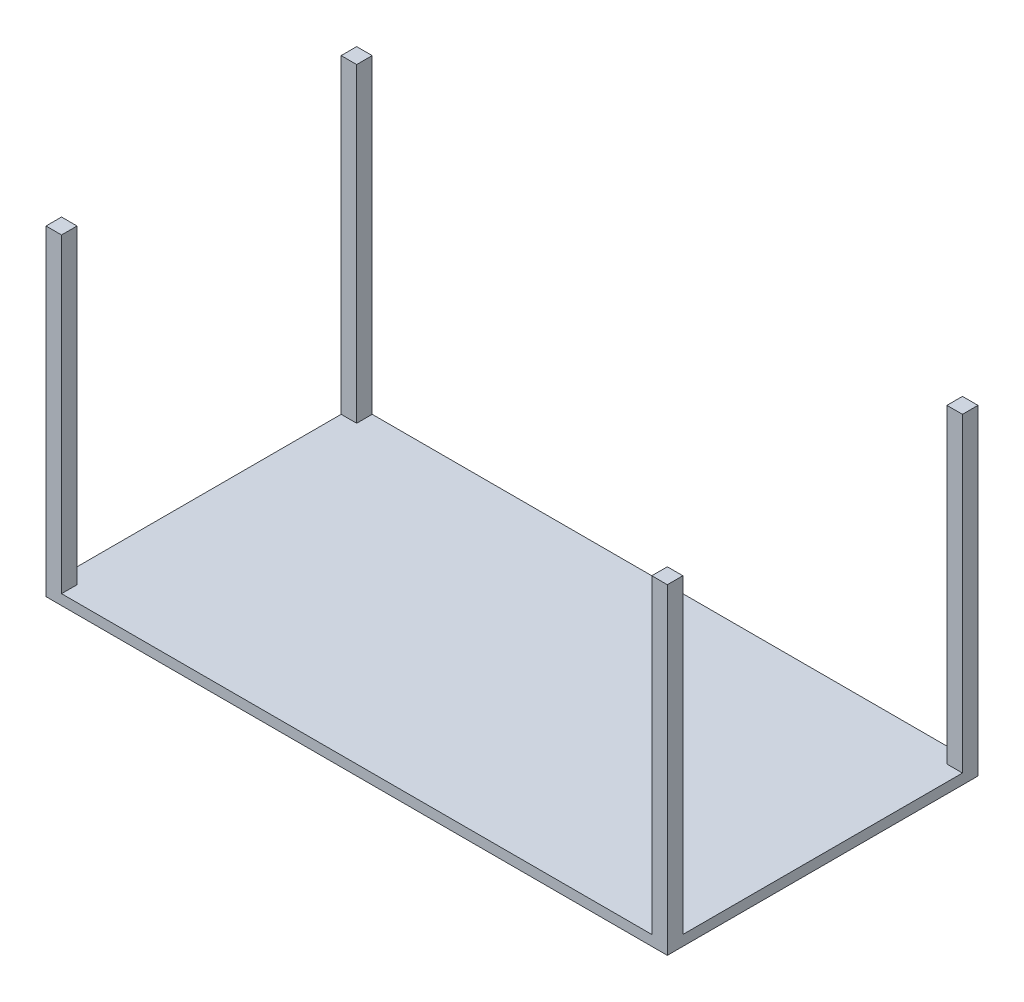
ISO-10303-21;
HEADER;
FILE_DESCRIPTION(('STEP AP214'),'2;1');
FILE_NAME('part.step','',(''),(''),'','','');
FILE_SCHEMA(('AUTOMOTIVE_DESIGN { 1 0 10303 214 1 1 1 1 }'));
ENDSEC;
DATA;
#1=APPLICATION_CONTEXT('core data for automotive mechanical design processes');
#2=APPLICATION_PROTOCOL_DEFINITION('international standard','automotive_design',2000,#1);
#3=PRODUCT_CONTEXT('',#1,'mechanical');
#4=PRODUCT('Part','Part','',(#3));
#5=PRODUCT_RELATED_PRODUCT_CATEGORY('part','',(#4));
#6=PRODUCT_DEFINITION_FORMATION('','',#4);
#7=PRODUCT_DEFINITION_CONTEXT('part definition',#1,'design');
#8=PRODUCT_DEFINITION('design','',#6,#7);
#9=PRODUCT_DEFINITION_SHAPE('','',#8);
#10=(LENGTH_UNIT() NAMED_UNIT(*) SI_UNIT(.MILLI.,.METRE.));
#11=(NAMED_UNIT(*) PLANE_ANGLE_UNIT() SI_UNIT($,.RADIAN.));
#12=(NAMED_UNIT(*) SI_UNIT($,.STERADIAN.) SOLID_ANGLE_UNIT());
#13=UNCERTAINTY_MEASURE_WITH_UNIT(LENGTH_MEASURE(1.E-05),#10,'distance_accuracy_value','');
#14=(GEOMETRIC_REPRESENTATION_CONTEXT(3) GLOBAL_UNCERTAINTY_ASSIGNED_CONTEXT((#13)) GLOBAL_UNIT_ASSIGNED_CONTEXT((#10,
#11,#12)) REPRESENTATION_CONTEXT('',''));
#15=CARTESIAN_POINT('',(0.,0.,0.));
#16=DIRECTION('',(0.,0.,1.));
#17=DIRECTION('',(1.,0.,0.));
#18=AXIS2_PLACEMENT_3D('',#15,#16,#17);
#19=CARTESIAN_POINT('',(0.,25.4,0.));
#20=DIRECTION('',(0.,1.,0.));
#21=DIRECTION('',(0.,0.,1.));
#22=AXIS2_PLACEMENT_3D('',#19,#20,#21);
#23=PLANE('',#22);
#24=DIRECTION('',(0.,0.,1.));
#25=VECTOR('',#24,1.);
#26=CARTESIAN_POINT('',(723.9,25.4,381.));
#27=LINE('',#26,#25);
#28=CARTESIAN_POINT('',(723.9,25.4,342.9));
#29=VERTEX_POINT('',#28);
#30=CARTESIAN_POINT('',(723.9,25.4,381.));
#31=VERTEX_POINT('',#30);
#32=EDGE_CURVE('E47',#29,#31,#27,.T.);
#33=ORIENTED_EDGE('',*,*,#32,.F.);
#34=DIRECTION('',(-1.,0.,0.));
#35=VECTOR('',#34,1.);
#36=CARTESIAN_POINT('',(762.,25.4,342.9));
#37=LINE('',#36,#35);
#38=CARTESIAN_POINT('',(762.,25.4,342.9));
#39=VERTEX_POINT('',#38);
#40=EDGE_CURVE('E51',#39,#29,#37,.T.);
#41=ORIENTED_EDGE('',*,*,#40,.F.);
#42=DIRECTION('',(0.,0.,-1.));
#43=VECTOR('',#42,1.);
#44=CARTESIAN_POINT('',(762.,25.4,-381.));
#45=LINE('',#44,#43);
#46=CARTESIAN_POINT('',(762.,25.4,-342.9));
#47=VERTEX_POINT('',#46);
#48=EDGE_CURVE('E165',#39,#47,#45,.T.);
#49=ORIENTED_EDGE('',*,*,#48,.T.);
#50=DIRECTION('',(1.,0.,0.));
#51=VECTOR('',#50,1.);
#52=CARTESIAN_POINT('',(762.,25.4,-342.9));
#53=LINE('',#52,#51);
#54=CARTESIAN_POINT('',(723.9,25.4,-342.9));
#55=VERTEX_POINT('',#54);
#56=EDGE_CURVE('E169',#55,#47,#53,.T.);
#57=ORIENTED_EDGE('',*,*,#56,.F.);
#58=DIRECTION('',(0.,0.,1.));
#59=VECTOR('',#58,1.);
#60=CARTESIAN_POINT('',(723.9,25.4,-381.));
#61=LINE('',#60,#59);
#62=CARTESIAN_POINT('',(723.9,25.4,-381.));
#63=VERTEX_POINT('',#62);
#64=EDGE_CURVE('E166',#63,#55,#61,.T.);
#65=ORIENTED_EDGE('',*,*,#64,.F.);
#66=DIRECTION('',(-1.,0.,0.));
#67=VECTOR('',#66,1.);
#68=CARTESIAN_POINT('',(-762.,25.4,-381.));
#69=LINE('',#68,#67);
#70=CARTESIAN_POINT('',(-723.9,25.4,-381.));
#71=VERTEX_POINT('',#70);
#72=EDGE_CURVE('E242',#63,#71,#69,.T.);
#73=ORIENTED_EDGE('',*,*,#72,.T.);
#74=DIRECTION('',(0.,0.,-1.));
#75=VECTOR('',#74,1.);
#76=CARTESIAN_POINT('',(-723.9,25.4,-381.));
#77=LINE('',#76,#75);
#78=CARTESIAN_POINT('',(-723.9,25.4,-342.9));
#79=VERTEX_POINT('',#78);
#80=EDGE_CURVE('E220',#79,#71,#77,.T.);
#81=ORIENTED_EDGE('',*,*,#80,.F.);
#82=DIRECTION('',(1.,0.,0.));
#83=VECTOR('',#82,1.);
#84=CARTESIAN_POINT('',(-762.,25.4,-342.9));
#85=LINE('',#84,#83);
#86=CARTESIAN_POINT('',(-762.,25.4,-342.9));
#87=VERTEX_POINT('',#86);
#88=EDGE_CURVE('E215',#87,#79,#85,.T.);
#89=ORIENTED_EDGE('',*,*,#88,.F.);
#90=DIRECTION('',(0.,0.,1.));
#91=VECTOR('',#90,1.);
#92=CARTESIAN_POINT('',(-762.,25.4,-381.));
#93=LINE('',#92,#91);
#94=CARTESIAN_POINT('',(-762.,25.4,342.9));
#95=VERTEX_POINT('',#94);
#96=EDGE_CURVE('E245',#87,#95,#93,.T.);
#97=ORIENTED_EDGE('',*,*,#96,.T.);
#98=DIRECTION('',(-1.,0.,0.));
#99=VECTOR('',#98,1.);
#100=CARTESIAN_POINT('',(-762.,25.4,342.9));
#101=LINE('',#100,#99);
#102=CARTESIAN_POINT('',(-723.9,25.4,342.9));
#103=VERTEX_POINT('',#102);
#104=EDGE_CURVE('E199',#103,#95,#101,.T.);
#105=ORIENTED_EDGE('',*,*,#104,.F.);
#106=DIRECTION('',(0.,0.,-1.));
#107=VECTOR('',#106,1.);
#108=CARTESIAN_POINT('',(-723.9,25.4,381.));
#109=LINE('',#108,#107);
#110=CARTESIAN_POINT('',(-723.9,25.4,381.));
#111=VERTEX_POINT('',#110);
#112=EDGE_CURVE('E194',#111,#103,#109,.T.);
#113=ORIENTED_EDGE('',*,*,#112,.F.);
#114=DIRECTION('',(1.,0.,0.));
#115=VECTOR('',#114,1.);
#116=CARTESIAN_POINT('',(-762.,25.4,381.));
#117=LINE('',#116,#115);
#118=EDGE_CURVE('E248',#111,#31,#117,.T.);
#119=ORIENTED_EDGE('',*,*,#118,.T.);
#120=EDGE_LOOP('',(#33,#41,#49,#57,#65,#73,#81,#89,#97,#105,#113,#119));
#121=FACE_BOUND('',#120,.T.);
#122=ADVANCED_FACE('F32',(#121),#23,.T.);
#123=CARTESIAN_POINT('',(762.,25.4,-381.));
#124=DIRECTION('',(-1.,0.,0.));
#125=DIRECTION('',(0.,0.,1.));
#126=AXIS2_PLACEMENT_3D('',#123,#124,#125);
#127=PLANE('',#126);
#128=DIRECTION('',(0.,0.,-1.));
#129=VECTOR('',#128,1.);
#130=CARTESIAN_POINT('',(762.,0.,-381.));
#131=LINE('',#130,#129);
#132=CARTESIAN_POINT('',(762.,0.,381.));
#133=VERTEX_POINT('',#132);
#134=CARTESIAN_POINT('',(762.,0.,-381.));
#135=VERTEX_POINT('',#134);
#136=EDGE_CURVE('E240',#133,#135,#131,.T.);
#137=ORIENTED_EDGE('',*,*,#136,.T.);
#138=DIRECTION('',(0.,-1.,0.));
#139=VECTOR('',#138,1.);
#140=CARTESIAN_POINT('',(762.,25.4,-381.));
#141=LINE('',#140,#139);
#142=CARTESIAN_POINT('',(762.,787.4,-381.));
#143=VERTEX_POINT('',#142);
#144=EDGE_CURVE('E11',#143,#135,#141,.T.);
#145=ORIENTED_EDGE('',*,*,#144,.F.);
#146=DIRECTION('',(0.,0.,-1.));
#147=VECTOR('',#146,1.);
#148=CARTESIAN_POINT('',(762.,787.4,-381.));
#149=LINE('',#148,#147);
#150=CARTESIAN_POINT('',(762.,787.4,-342.9));
#151=VERTEX_POINT('',#150);
#152=EDGE_CURVE('E175',#151,#143,#149,.T.);
#153=ORIENTED_EDGE('',*,*,#152,.F.);
#154=DIRECTION('',(0.,-1.,0.));
#155=VECTOR('',#154,1.);
#156=CARTESIAN_POINT('',(762.,787.4,-342.9));
#157=LINE('',#156,#155);
#158=EDGE_CURVE('E183',#151,#47,#157,.T.);
#159=ORIENTED_EDGE('',*,*,#158,.T.);
#160=ORIENTED_EDGE('',*,*,#48,.F.);
#161=DIRECTION('',(0.,-1.,0.));
#162=VECTOR('',#161,1.);
#163=CARTESIAN_POINT('',(762.,787.4,342.9));
#164=LINE('',#163,#162);
#165=CARTESIAN_POINT('',(762.,787.4,342.9));
#166=VERTEX_POINT('',#165);
#167=EDGE_CURVE('E147',#166,#39,#164,.T.);
#168=ORIENTED_EDGE('',*,*,#167,.F.);
#169=DIRECTION('',(0.,0.,-1.));
#170=VECTOR('',#169,1.);
#171=CARTESIAN_POINT('',(762.,787.4,381.));
#172=LINE('',#171,#170);
#173=CARTESIAN_POINT('',(762.,787.4,381.));
#174=VERTEX_POINT('',#173);
#175=EDGE_CURVE('E153',#174,#166,#172,.T.);
#176=ORIENTED_EDGE('',*,*,#175,.F.);
#177=DIRECTION('',(0.,-1.,0.));
#178=VECTOR('',#177,1.);
#179=CARTESIAN_POINT('',(762.,25.4,381.));
#180=LINE('',#179,#178);
#181=EDGE_CURVE('E250',#174,#133,#180,.T.);
#182=ORIENTED_EDGE('',*,*,#181,.T.);
#183=EDGE_LOOP('',(#137,#145,#153,#159,#160,#168,#176,#182));
#184=FACE_BOUND('',#183,.T.);
#185=ADVANCED_FACE('F34',(#184),#127,.F.);
#186=CARTESIAN_POINT('',(-762.,25.4,-381.));
#187=DIRECTION('',(0.,0.,1.));
#188=DIRECTION('',(1.,0.,0.));
#189=AXIS2_PLACEMENT_3D('',#186,#187,#188);
#190=PLANE('',#189);
#191=DIRECTION('',(-1.,0.,0.));
#192=VECTOR('',#191,1.);
#193=CARTESIAN_POINT('',(-762.,0.,-381.));
#194=LINE('',#193,#192);
#195=CARTESIAN_POINT('',(-762.,0.,-381.));
#196=VERTEX_POINT('',#195);
#197=EDGE_CURVE('E252',#135,#196,#194,.T.);
#198=ORIENTED_EDGE('',*,*,#197,.T.);
#199=DIRECTION('',(0.,-1.,0.));
#200=VECTOR('',#199,1.);
#201=CARTESIAN_POINT('',(-762.,25.4,-381.));
#202=LINE('',#201,#200);
#203=CARTESIAN_POINT('',(-762.,787.4,-381.));
#204=VERTEX_POINT('',#203);
#205=EDGE_CURVE('E40',#204,#196,#202,.T.);
#206=ORIENTED_EDGE('',*,*,#205,.F.);
#207=DIRECTION('',(-1.,0.,0.));
#208=VECTOR('',#207,1.);
#209=CARTESIAN_POINT('',(-762.,787.4,-381.));
#210=LINE('',#209,#208);
#211=CARTESIAN_POINT('',(-723.9,787.4,-381.));
#212=VERTEX_POINT('',#211);
#213=EDGE_CURVE('E224',#212,#204,#210,.T.);
#214=ORIENTED_EDGE('',*,*,#213,.F.);
#215=DIRECTION('',(0.,-1.,0.));
#216=VECTOR('',#215,1.);
#217=CARTESIAN_POINT('',(-723.9,787.4,-381.));
#218=LINE('',#217,#216);
#219=EDGE_CURVE('E227',#212,#71,#218,.T.);
#220=ORIENTED_EDGE('',*,*,#219,.T.);
#221=ORIENTED_EDGE('',*,*,#72,.F.);
#222=DIRECTION('',(0.,-1.,0.));
#223=VECTOR('',#222,1.);
#224=CARTESIAN_POINT('',(723.9,787.4,-381.));
#225=LINE('',#224,#223);
#226=CARTESIAN_POINT('',(723.9,787.4,-381.));
#227=VERTEX_POINT('',#226);
#228=EDGE_CURVE('E191',#227,#63,#225,.T.);
#229=ORIENTED_EDGE('',*,*,#228,.F.);
#230=DIRECTION('',(-1.,0.,0.));
#231=VECTOR('',#230,1.);
#232=CARTESIAN_POINT('',(762.,787.4,-381.));
#233=LINE('',#232,#231);
#234=EDGE_CURVE('E178',#143,#227,#233,.T.);
#235=ORIENTED_EDGE('',*,*,#234,.F.);
#236=ORIENTED_EDGE('',*,*,#144,.T.);
#237=EDGE_LOOP('',(#198,#206,#214,#220,#221,#229,#235,#236));
#238=FACE_BOUND('',#237,.T.);
#239=ADVANCED_FACE('F278',(#238),#190,.F.);
#240=CARTESIAN_POINT('',(-762.,25.4,-381.));
#241=DIRECTION('',(1.,0.,0.));
#242=DIRECTION('',(0.,0.,-1.));
#243=AXIS2_PLACEMENT_3D('',#240,#241,#242);
#244=PLANE('',#243);
#245=DIRECTION('',(0.,0.,1.));
#246=VECTOR('',#245,1.);
#247=CARTESIAN_POINT('',(-762.,0.,-381.));
#248=LINE('',#247,#246);
#249=CARTESIAN_POINT('',(-762.,0.,381.));
#250=VERTEX_POINT('',#249);
#251=EDGE_CURVE('E254',#196,#250,#248,.T.);
#252=ORIENTED_EDGE('',*,*,#251,.T.);
#253=DIRECTION('',(0.,-1.,0.));
#254=VECTOR('',#253,1.);
#255=CARTESIAN_POINT('',(-762.,25.4,381.));
#256=LINE('',#255,#254);
#257=CARTESIAN_POINT('',(-762.,787.4,381.));
#258=VERTEX_POINT('',#257);
#259=EDGE_CURVE('E258',#258,#250,#256,.T.);
#260=ORIENTED_EDGE('',*,*,#259,.F.);
#261=DIRECTION('',(0.,0.,1.));
#262=VECTOR('',#261,1.);
#263=CARTESIAN_POINT('',(-762.,787.4,381.));
#264=LINE('',#263,#262);
#265=CARTESIAN_POINT('',(-762.,787.4,342.9));
#266=VERTEX_POINT('',#265);
#267=EDGE_CURVE('E195',#266,#258,#264,.T.);
#268=ORIENTED_EDGE('',*,*,#267,.F.);
#269=DIRECTION('',(0.,-1.,0.));
#270=VECTOR('',#269,1.);
#271=CARTESIAN_POINT('',(-762.,787.4,342.9));
#272=LINE('',#271,#270);
#273=EDGE_CURVE('E205',#266,#95,#272,.T.);
#274=ORIENTED_EDGE('',*,*,#273,.T.);
#275=ORIENTED_EDGE('',*,*,#96,.F.);
#276=DIRECTION('',(0.,-1.,0.));
#277=VECTOR('',#276,1.);
#278=CARTESIAN_POINT('',(-762.,787.4,-342.9));
#279=LINE('',#278,#277);
#280=CARTESIAN_POINT('',(-762.,787.4,-342.9));
#281=VERTEX_POINT('',#280);
#282=EDGE_CURVE('E237',#281,#87,#279,.T.);
#283=ORIENTED_EDGE('',*,*,#282,.F.);
#284=DIRECTION('',(0.,0.,1.));
#285=VECTOR('',#284,1.);
#286=CARTESIAN_POINT('',(-762.,787.4,-381.));
#287=LINE('',#286,#285);
#288=EDGE_CURVE('E216',#204,#281,#287,.T.);
#289=ORIENTED_EDGE('',*,*,#288,.F.);
#290=ORIENTED_EDGE('',*,*,#205,.T.);
#291=EDGE_LOOP('',(#252,#260,#268,#274,#275,#283,#289,#290));
#292=FACE_BOUND('',#291,.T.);
#293=ADVANCED_FACE('F264',(#292),#244,.F.);
#294=CARTESIAN_POINT('',(-762.,25.4,381.));
#295=DIRECTION('',(0.,0.,-1.));
#296=DIRECTION('',(-1.,0.,0.));
#297=AXIS2_PLACEMENT_3D('',#294,#295,#296);
#298=PLANE('',#297);
#299=DIRECTION('',(1.,0.,0.));
#300=VECTOR('',#299,1.);
#301=CARTESIAN_POINT('',(-762.,0.,381.));
#302=LINE('',#301,#300);
#303=EDGE_CURVE('E243',#250,#133,#302,.T.);
#304=ORIENTED_EDGE('',*,*,#303,.T.);
#305=ORIENTED_EDGE('',*,*,#181,.F.);
#306=DIRECTION('',(1.,0.,0.));
#307=VECTOR('',#306,1.);
#308=CARTESIAN_POINT('',(762.,787.4,381.));
#309=LINE('',#308,#307);
#310=CARTESIAN_POINT('',(723.9,787.4,381.));
#311=VERTEX_POINT('',#310);
#312=EDGE_CURVE('E159',#311,#174,#309,.T.);
#313=ORIENTED_EDGE('',*,*,#312,.F.);
#314=DIRECTION('',(0.,-1.,0.));
#315=VECTOR('',#314,1.);
#316=CARTESIAN_POINT('',(723.9,787.4,381.));
#317=LINE('',#316,#315);
#318=EDGE_CURVE('E171',#311,#31,#317,.T.);
#319=ORIENTED_EDGE('',*,*,#318,.T.);
#320=ORIENTED_EDGE('',*,*,#118,.F.);
#321=DIRECTION('',(0.,-1.,0.));
#322=VECTOR('',#321,1.);
#323=CARTESIAN_POINT('',(-723.9,787.4,381.));
#324=LINE('',#323,#322);
#325=CARTESIAN_POINT('',(-723.9,787.4,381.));
#326=VERTEX_POINT('',#325);
#327=EDGE_CURVE('E213',#326,#111,#324,.T.);
#328=ORIENTED_EDGE('',*,*,#327,.F.);
#329=DIRECTION('',(1.,0.,0.));
#330=VECTOR('',#329,1.);
#331=CARTESIAN_POINT('',(-762.,787.4,381.));
#332=LINE('',#331,#330);
#333=EDGE_CURVE('E198',#258,#326,#332,.T.);
#334=ORIENTED_EDGE('',*,*,#333,.F.);
#335=ORIENTED_EDGE('',*,*,#259,.T.);
#336=EDGE_LOOP('',(#304,#305,#313,#319,#320,#328,#334,#335));
#337=FACE_BOUND('',#336,.T.);
#338=ADVANCED_FACE('F273',(#337),#298,.F.);
#339=CARTESIAN_POINT('',(0.,0.,0.));
#340=DIRECTION('',(0.,1.,0.));
#341=DIRECTION('',(0.,0.,1.));
#342=AXIS2_PLACEMENT_3D('',#339,#340,#341);
#343=PLANE('',#342);
#344=ORIENTED_EDGE('',*,*,#136,.F.);
#345=ORIENTED_EDGE('',*,*,#303,.F.);
#346=ORIENTED_EDGE('',*,*,#251,.F.);
#347=ORIENTED_EDGE('',*,*,#197,.F.);
#348=EDGE_LOOP('',(#344,#345,#346,#347));
#349=FACE_BOUND('',#348,.T.);
#350=ADVANCED_FACE('F271',(#349),#343,.F.);
#351=CARTESIAN_POINT('',(-762.,787.4,-342.9));
#352=DIRECTION('',(0.,0.,-1.));
#353=DIRECTION('',(-1.,0.,0.));
#354=AXIS2_PLACEMENT_3D('',#351,#352,#353);
#355=PLANE('',#354);
#356=ORIENTED_EDGE('',*,*,#88,.T.);
#357=DIRECTION('',(0.,-1.,0.));
#358=VECTOR('',#357,1.);
#359=CARTESIAN_POINT('',(-723.9,787.4,-342.9));
#360=LINE('',#359,#358);
#361=CARTESIAN_POINT('',(-723.9,787.4,-342.9));
#362=VERTEX_POINT('',#361);
#363=EDGE_CURVE('E234',#362,#79,#360,.T.);
#364=ORIENTED_EDGE('',*,*,#363,.F.);
#365=DIRECTION('',(1.,0.,0.));
#366=VECTOR('',#365,1.);
#367=CARTESIAN_POINT('',(-762.,787.4,-342.9));
#368=LINE('',#367,#366);
#369=EDGE_CURVE('E219',#281,#362,#368,.T.);
#370=ORIENTED_EDGE('',*,*,#369,.F.);
#371=ORIENTED_EDGE('',*,*,#282,.T.);
#372=EDGE_LOOP('',(#356,#364,#370,#371));
#373=FACE_BOUND('',#372,.T.);
#374=ADVANCED_FACE('F308',(#373),#355,.F.);
#375=CARTESIAN_POINT('',(-723.9,787.4,-381.));
#376=DIRECTION('',(-1.,0.,0.));
#377=DIRECTION('',(0.,0.,1.));
#378=AXIS2_PLACEMENT_3D('',#375,#376,#377);
#379=PLANE('',#378);
#380=ORIENTED_EDGE('',*,*,#80,.T.);
#381=ORIENTED_EDGE('',*,*,#219,.F.);
#382=DIRECTION('',(0.,0.,-1.));
#383=VECTOR('',#382,1.);
#384=CARTESIAN_POINT('',(-723.9,787.4,-381.));
#385=LINE('',#384,#383);
#386=EDGE_CURVE('E222',#362,#212,#385,.T.);
#387=ORIENTED_EDGE('',*,*,#386,.F.);
#388=ORIENTED_EDGE('',*,*,#363,.T.);
#389=EDGE_LOOP('',(#380,#381,#387,#388));
#390=FACE_BOUND('',#389,.T.);
#391=ADVANCED_FACE('F338',(#390),#379,.F.);
#392=CARTESIAN_POINT('',(0.,787.4,0.));
#393=DIRECTION('',(0.,1.,0.));
#394=DIRECTION('',(0.,0.,1.));
#395=AXIS2_PLACEMENT_3D('',#392,#393,#394);
#396=PLANE('',#395);
#397=ORIENTED_EDGE('',*,*,#288,.T.);
#398=ORIENTED_EDGE('',*,*,#369,.T.);
#399=ORIENTED_EDGE('',*,*,#386,.T.);
#400=ORIENTED_EDGE('',*,*,#213,.T.);
#401=EDGE_LOOP('',(#397,#398,#399,#400));
#402=FACE_BOUND('',#401,.T.);
#403=ADVANCED_FACE('F345',(#402),#396,.T.);
#404=CARTESIAN_POINT('',(-723.9,787.4,381.));
#405=DIRECTION('',(-1.,0.,0.));
#406=DIRECTION('',(0.,0.,1.));
#407=AXIS2_PLACEMENT_3D('',#404,#405,#406);
#408=PLANE('',#407);
#409=ORIENTED_EDGE('',*,*,#112,.T.);
#410=DIRECTION('',(0.,-1.,0.));
#411=VECTOR('',#410,1.);
#412=CARTESIAN_POINT('',(-723.9,787.4,342.9));
#413=LINE('',#412,#411);
#414=CARTESIAN_POINT('',(-723.9,787.4,342.9));
#415=VERTEX_POINT('',#414);
#416=EDGE_CURVE('E211',#415,#103,#413,.T.);
#417=ORIENTED_EDGE('',*,*,#416,.F.);
#418=DIRECTION('',(0.,0.,-1.));
#419=VECTOR('',#418,1.);
#420=CARTESIAN_POINT('',(-723.9,787.4,381.));
#421=LINE('',#420,#419);
#422=EDGE_CURVE('E201',#326,#415,#421,.T.);
#423=ORIENTED_EDGE('',*,*,#422,.F.);
#424=ORIENTED_EDGE('',*,*,#327,.T.);
#425=EDGE_LOOP('',(#409,#417,#423,#424));
#426=FACE_BOUND('',#425,.T.);
#427=ADVANCED_FACE('F352',(#426),#408,.F.);
#428=CARTESIAN_POINT('',(-762.,787.4,342.9));
#429=DIRECTION('',(0.,0.,1.));
#430=DIRECTION('',(1.,0.,0.));
#431=AXIS2_PLACEMENT_3D('',#428,#429,#430);
#432=PLANE('',#431);
#433=ORIENTED_EDGE('',*,*,#104,.T.);
#434=ORIENTED_EDGE('',*,*,#273,.F.);
#435=DIRECTION('',(-1.,0.,0.));
#436=VECTOR('',#435,1.);
#437=CARTESIAN_POINT('',(-762.,787.4,342.9));
#438=LINE('',#437,#436);
#439=EDGE_CURVE('E203',#415,#266,#438,.T.);
#440=ORIENTED_EDGE('',*,*,#439,.F.);
#441=ORIENTED_EDGE('',*,*,#416,.T.);
#442=EDGE_LOOP('',(#433,#434,#440,#441));
#443=FACE_BOUND('',#442,.T.);
#444=ADVANCED_FACE('F298',(#443),#432,.F.);
#445=CARTESIAN_POINT('',(0.,787.4,0.));
#446=DIRECTION('',(0.,-1.,0.));
#447=DIRECTION('',(0.,0.,-1.));
#448=AXIS2_PLACEMENT_3D('',#445,#446,#447);
#449=PLANE('',#448);
#450=ORIENTED_EDGE('',*,*,#267,.T.);
#451=ORIENTED_EDGE('',*,*,#333,.T.);
#452=ORIENTED_EDGE('',*,*,#422,.T.);
#453=ORIENTED_EDGE('',*,*,#439,.T.);
#454=EDGE_LOOP('',(#450,#451,#452,#453));
#455=FACE_BOUND('',#454,.T.);
#456=ADVANCED_FACE('F291',(#455),#449,.F.);
#457=CARTESIAN_POINT('',(723.9,787.4,-381.));
#458=DIRECTION('',(1.,0.,0.));
#459=DIRECTION('',(0.,0.,-1.));
#460=AXIS2_PLACEMENT_3D('',#457,#458,#459);
#461=PLANE('',#460);
#462=ORIENTED_EDGE('',*,*,#64,.T.);
#463=DIRECTION('',(0.,-1.,0.));
#464=VECTOR('',#463,1.);
#465=CARTESIAN_POINT('',(723.9,787.4,-342.9));
#466=LINE('',#465,#464);
#467=CARTESIAN_POINT('',(723.9,787.4,-342.9));
#468=VERTEX_POINT('',#467);
#469=EDGE_CURVE('E188',#468,#55,#466,.T.);
#470=ORIENTED_EDGE('',*,*,#469,.F.);
#471=DIRECTION('',(0.,0.,1.));
#472=VECTOR('',#471,1.);
#473=CARTESIAN_POINT('',(723.9,787.4,-381.));
#474=LINE('',#473,#472);
#475=EDGE_CURVE('E180',#227,#468,#474,.T.);
#476=ORIENTED_EDGE('',*,*,#475,.F.);
#477=ORIENTED_EDGE('',*,*,#228,.T.);
#478=EDGE_LOOP('',(#462,#470,#476,#477));
#479=FACE_BOUND('',#478,.T.);
#480=ADVANCED_FACE('F289',(#479),#461,.F.);
#481=CARTESIAN_POINT('',(762.,787.4,-342.9));
#482=DIRECTION('',(0.,0.,-1.));
#483=DIRECTION('',(-1.,0.,0.));
#484=AXIS2_PLACEMENT_3D('',#481,#482,#483);
#485=PLANE('',#484);
#486=ORIENTED_EDGE('',*,*,#56,.T.);
#487=ORIENTED_EDGE('',*,*,#158,.F.);
#488=DIRECTION('',(1.,0.,0.));
#489=VECTOR('',#488,1.);
#490=CARTESIAN_POINT('',(762.,787.4,-342.9));
#491=LINE('',#490,#489);
#492=EDGE_CURVE('E182',#468,#151,#491,.T.);
#493=ORIENTED_EDGE('',*,*,#492,.F.);
#494=ORIENTED_EDGE('',*,*,#469,.T.);
#495=EDGE_LOOP('',(#486,#487,#493,#494));
#496=FACE_BOUND('',#495,.T.);
#497=ADVANCED_FACE('F286',(#496),#485,.F.);
#498=CARTESIAN_POINT('',(0.,787.4,0.));
#499=DIRECTION('',(0.,-1.,0.));
#500=DIRECTION('',(0.,0.,-1.));
#501=AXIS2_PLACEMENT_3D('',#498,#499,#500);
#502=PLANE('',#501);
#503=ORIENTED_EDGE('',*,*,#152,.T.);
#504=ORIENTED_EDGE('',*,*,#234,.T.);
#505=ORIENTED_EDGE('',*,*,#475,.T.);
#506=ORIENTED_EDGE('',*,*,#492,.T.);
#507=EDGE_LOOP('',(#503,#504,#505,#506));
#508=FACE_BOUND('',#507,.T.);
#509=ADVANCED_FACE('F281',(#508),#502,.F.);
#510=CARTESIAN_POINT('',(762.,787.4,342.9));
#511=DIRECTION('',(0.,0.,1.));
#512=DIRECTION('',(1.,0.,0.));
#513=AXIS2_PLACEMENT_3D('',#510,#511,#512);
#514=PLANE('',#513);
#515=ORIENTED_EDGE('',*,*,#40,.T.);
#516=DIRECTION('',(0.,-1.,0.));
#517=VECTOR('',#516,1.);
#518=CARTESIAN_POINT('',(723.9,787.4,342.9));
#519=LINE('',#518,#517);
#520=CARTESIAN_POINT('',(723.9,787.4,342.9));
#521=VERTEX_POINT('',#520);
#522=EDGE_CURVE('E149',#521,#29,#519,.T.);
#523=ORIENTED_EDGE('',*,*,#522,.F.);
#524=DIRECTION('',(-1.,0.,0.));
#525=VECTOR('',#524,1.);
#526=CARTESIAN_POINT('',(762.,787.4,342.9));
#527=LINE('',#526,#525);
#528=EDGE_CURVE('E143',#166,#521,#527,.T.);
#529=ORIENTED_EDGE('',*,*,#528,.F.);
#530=ORIENTED_EDGE('',*,*,#167,.T.);
#531=EDGE_LOOP('',(#515,#523,#529,#530));
#532=FACE_BOUND('',#531,.T.);
#533=ADVANCED_FACE('F145',(#532),#514,.F.);
#534=CARTESIAN_POINT('',(723.9,787.4,381.));
#535=DIRECTION('',(1.,0.,0.));
#536=DIRECTION('',(0.,0.,-1.));
#537=AXIS2_PLACEMENT_3D('',#534,#535,#536);
#538=PLANE('',#537);
#539=ORIENTED_EDGE('',*,*,#32,.T.);
#540=ORIENTED_EDGE('',*,*,#318,.F.);
#541=DIRECTION('',(0.,0.,1.));
#542=VECTOR('',#541,1.);
#543=CARTESIAN_POINT('',(723.9,787.4,381.));
#544=LINE('',#543,#542);
#545=EDGE_CURVE('E152',#521,#311,#544,.T.);
#546=ORIENTED_EDGE('',*,*,#545,.F.);
#547=ORIENTED_EDGE('',*,*,#522,.T.);
#548=EDGE_LOOP('',(#539,#540,#546,#547));
#549=FACE_BOUND('',#548,.T.);
#550=ADVANCED_FACE('F399',(#549),#538,.F.);
#551=CARTESIAN_POINT('',(0.,787.4,0.));
#552=DIRECTION('',(0.,1.,0.));
#553=DIRECTION('',(0.,0.,1.));
#554=AXIS2_PLACEMENT_3D('',#551,#552,#553);
#555=PLANE('',#554);
#556=ORIENTED_EDGE('',*,*,#175,.T.);
#557=ORIENTED_EDGE('',*,*,#528,.T.);
#558=ORIENTED_EDGE('',*,*,#545,.T.);
#559=ORIENTED_EDGE('',*,*,#312,.T.);
#560=EDGE_LOOP('',(#556,#557,#558,#559));
#561=FACE_BOUND('',#560,.T.);
#562=ADVANCED_FACE('F157',(#561),#555,.T.);
#563=CLOSED_SHELL('',(#122,#185,#239,#293,#338,#350,#374,#391,#403,#427,#444,#456,#480,#497,
#509,#533,#550,#562));
#564=MANIFOLD_SOLID_BREP('B2',#563);
#565=ADVANCED_BREP_SHAPE_REPRESENTATION('',(#18,#564),#14);
#566=SHAPE_DEFINITION_REPRESENTATION(#9,#565);
ENDSEC;
END-ISO-10303-21;
